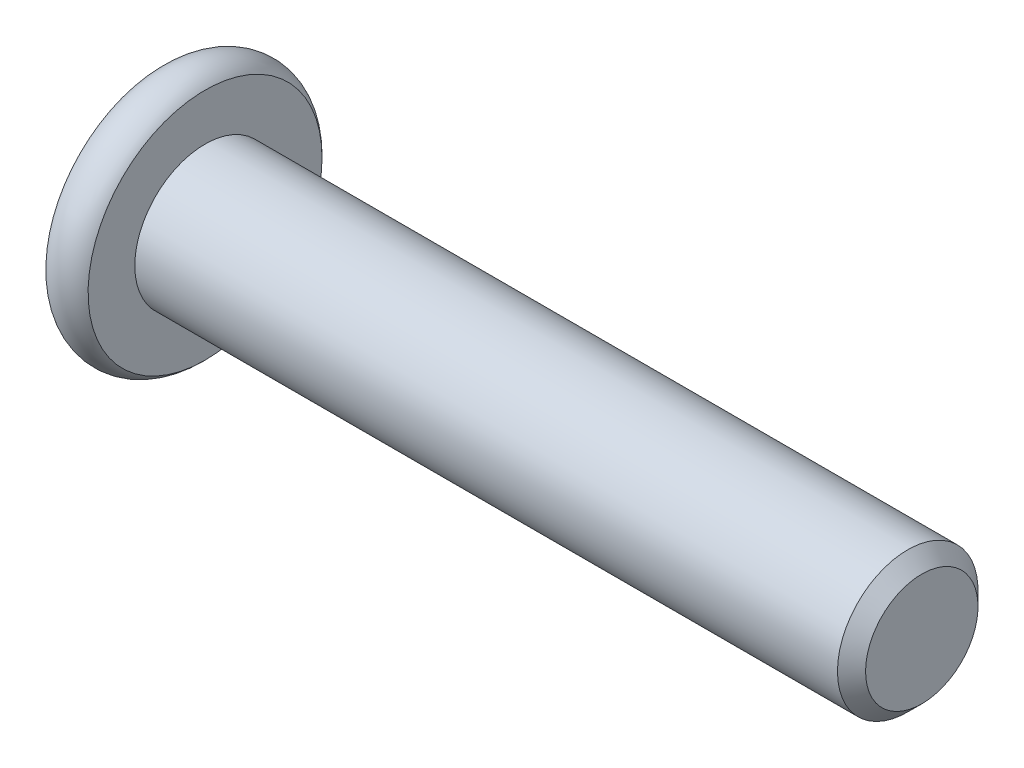
ISO-10303-21;
HEADER;
FILE_DESCRIPTION(('STEP AP214'),'2;1');
FILE_NAME('part.step','',(''),(''),'','','');
FILE_SCHEMA(('AUTOMOTIVE_DESIGN { 1 0 10303 214 1 1 1 1 }'));
ENDSEC;
DATA;
#1=APPLICATION_CONTEXT('core data for automotive mechanical design processes');
#2=APPLICATION_PROTOCOL_DEFINITION('international standard','automotive_design',2000,#1);
#3=PRODUCT_CONTEXT('',#1,'mechanical');
#4=PRODUCT('Part','Part','',(#3));
#5=PRODUCT_RELATED_PRODUCT_CATEGORY('part','',(#4));
#6=PRODUCT_DEFINITION_FORMATION('','',#4);
#7=PRODUCT_DEFINITION_CONTEXT('part definition',#1,'design');
#8=PRODUCT_DEFINITION('design','',#6,#7);
#9=PRODUCT_DEFINITION_SHAPE('','',#8);
#10=(LENGTH_UNIT() NAMED_UNIT(*) SI_UNIT(.MILLI.,.METRE.));
#11=(NAMED_UNIT(*) PLANE_ANGLE_UNIT() SI_UNIT($,.RADIAN.));
#12=(NAMED_UNIT(*) SI_UNIT($,.STERADIAN.) SOLID_ANGLE_UNIT());
#13=UNCERTAINTY_MEASURE_WITH_UNIT(LENGTH_MEASURE(1.E-05),#10,'distance_accuracy_value','');
#14=(GEOMETRIC_REPRESENTATION_CONTEXT(3) GLOBAL_UNCERTAINTY_ASSIGNED_CONTEXT((#13)) GLOBAL_UNIT_ASSIGNED_CONTEXT((#10,
#11,#12)) REPRESENTATION_CONTEXT('',''));
#15=CARTESIAN_POINT('',(0.,0.,0.));
#16=DIRECTION('',(0.,0.,1.));
#17=DIRECTION('',(1.,0.,0.));
#18=AXIS2_PLACEMENT_3D('',#15,#16,#17);
#19=CARTESIAN_POINT('',(-19.2,0.866025403784513,1.5));
#20=DIRECTION('',(0.,0.866025403784439,0.5));
#21=DIRECTION('',(1.,0.,0.));
#22=AXIS2_PLACEMENT_3D('',#19,#20,#21);
#23=PLANE('',#22);
#24=DIRECTION('',(-1.,0.,0.));
#25=VECTOR('',#24,1.);
#26=CARTESIAN_POINT('',(-19.2,0.866025403784513,1.5));
#27=LINE('',#26,#25);
#28=CARTESIAN_POINT('',(-19.2,0.866025403784513,1.5));
#29=VERTEX_POINT('',#28);
#30=CARTESIAN_POINT('',(-21.45,0.866025403784521,1.5));
#31=VERTEX_POINT('',#30);
#32=EDGE_CURVE('E11',#29,#31,#27,.T.);
#33=ORIENTED_EDGE('',*,*,#32,.T.);
#34=CARTESIAN_POINT('',(-21.45,0.866025403784521,1.5));
#35=CARTESIAN_POINT('',(-21.0169872981078,1.29903810567674,0.75));
#36=CARTESIAN_POINT('',(-21.45,1.73205080756896,0.));
#37=(BOUNDED_CURVE() B_SPLINE_CURVE(2,(#34,#35,#36),.UNSPECIFIED.,.F.,
.F.) B_SPLINE_CURVE_WITH_KNOTS((3,3),(-0.397875803425302,-0.136294992073016),
.UNSPECIFIED.) CURVE() GEOMETRIC_REPRESENTATION_ITEM() RATIONAL_B_SPLINE_CURVE((1.32487113059643,
1.52982940778283,1.32487113059643)) REPRESENTATION_ITEM(''));
#38=CARTESIAN_POINT('',(-21.45,1.73205080756896,0.));
#39=VERTEX_POINT('',#38);
#40=EDGE_CURVE('E217',#31,#39,#37,.T.);
#41=ORIENTED_EDGE('',*,*,#40,.T.);
#42=DIRECTION('',(-1.,0.,0.));
#43=VECTOR('',#42,1.);
#44=CARTESIAN_POINT('',(-19.2,1.73205080756895,0.));
#45=LINE('',#44,#43);
#46=CARTESIAN_POINT('',(-19.2,1.73205080756895,0.));
#47=VERTEX_POINT('',#46);
#48=EDGE_CURVE('E229',#47,#39,#45,.T.);
#49=ORIENTED_EDGE('',*,*,#48,.F.);
#50=DIRECTION('',(0.,0.5,-0.866025403784439));
#51=VECTOR('',#50,1.);
#52=CARTESIAN_POINT('',(-19.2,0.866025403784513,1.5));
#53=LINE('',#52,#51);
#54=EDGE_CURVE('E208',#29,#47,#53,.T.);
#55=ORIENTED_EDGE('',*,*,#54,.F.);
#56=EDGE_LOOP('',(#33,#41,#49,#55));
#57=FACE_BOUND('',#56,.T.);
#58=ADVANCED_FACE('F16',(#57),#23,.F.);
#59=CARTESIAN_POINT('',(-19.2,-0.866025403784366,1.5));
#60=DIRECTION('',(0.,0.,1.));
#61=DIRECTION('',(1.,0.,0.));
#62=AXIS2_PLACEMENT_3D('',#59,#60,#61);
#63=PLANE('',#62);
#64=DIRECTION('',(-1.,0.,0.));
#65=VECTOR('',#64,1.);
#66=CARTESIAN_POINT('',(-19.2,-0.866025403784366,1.5));
#67=LINE('',#66,#65);
#68=CARTESIAN_POINT('',(-19.2,-0.866025403784366,1.5));
#69=VERTEX_POINT('',#68);
#70=CARTESIAN_POINT('',(-21.45,-0.866025403784357,1.5));
#71=VERTEX_POINT('',#70);
#72=EDGE_CURVE('E27',#69,#71,#67,.T.);
#73=ORIENTED_EDGE('',*,*,#72,.T.);
#74=CARTESIAN_POINT('',(-21.45,-0.866025403784347,1.5));
#75=CARTESIAN_POINT('',(-21.0169872981078,0.,1.5));
#76=CARTESIAN_POINT('',(-21.45,0.866025403784519,1.5));
#77=(BOUNDED_CURVE() B_SPLINE_CURVE(2,(#74,#75,#76),.UNSPECIFIED.,.F.,
.F.) B_SPLINE_CURVE_WITH_KNOTS((3,3),(-0.397875803425301,-0.136294992073016),
.UNSPECIFIED.) CURVE() GEOMETRIC_REPRESENTATION_ITEM() RATIONAL_B_SPLINE_CURVE((1.32487113059644,
1.52982940778283,1.32487113059643)) REPRESENTATION_ITEM(''));
#78=EDGE_CURVE('E144',#71,#31,#77,.T.);
#79=ORIENTED_EDGE('',*,*,#78,.T.);
#80=ORIENTED_EDGE('',*,*,#32,.F.);
#81=DIRECTION('',(0.,1.,0.));
#82=VECTOR('',#81,1.);
#83=CARTESIAN_POINT('',(-19.2,-0.866025403784366,1.5));
#84=LINE('',#83,#82);
#85=EDGE_CURVE('E158',#69,#29,#84,.T.);
#86=ORIENTED_EDGE('',*,*,#85,.F.);
#87=EDGE_LOOP('',(#73,#79,#80,#86));
#88=FACE_BOUND('',#87,.T.);
#89=ADVANCED_FACE('F317',(#88),#63,.F.);
#90=CARTESIAN_POINT('',(-19.2,-1.7320508075688,0.));
#91=DIRECTION('',(0.,-0.866025403784439,0.5));
#92=DIRECTION('',(-1.,0.,0.));
#93=AXIS2_PLACEMENT_3D('',#90,#91,#92);
#94=PLANE('',#93);
#95=DIRECTION('',(-1.,0.,0.));
#96=VECTOR('',#95,1.);
#97=CARTESIAN_POINT('',(-19.2,-1.7320508075688,0.));
#98=LINE('',#97,#96);
#99=CARTESIAN_POINT('',(-19.2,-1.7320508075688,0.));
#100=VERTEX_POINT('',#99);
#101=CARTESIAN_POINT('',(-21.45,-1.73205080756879,0.));
#102=VERTEX_POINT('',#101);
#103=EDGE_CURVE('E123',#100,#102,#98,.T.);
#104=ORIENTED_EDGE('',*,*,#103,.T.);
#105=CARTESIAN_POINT('',(-21.45,-1.73205080756879,0.));
#106=CARTESIAN_POINT('',(-21.0169872981078,-1.29903810567658,0.750000000000001));
#107=CARTESIAN_POINT('',(-21.45,-0.866025403784359,1.5));
#108=(BOUNDED_CURVE() B_SPLINE_CURVE(2,(#105,#106,#107),.UNSPECIFIED.,.F.,
.F.) B_SPLINE_CURVE_WITH_KNOTS((3,3),(-0.397875803425302,-0.136294992073015),
.UNSPECIFIED.) CURVE() GEOMETRIC_REPRESENTATION_ITEM() RATIONAL_B_SPLINE_CURVE((1.32487113059644,
1.52982940778284,1.32487113059644)) REPRESENTATION_ITEM(''));
#109=EDGE_CURVE('E137',#102,#71,#108,.T.);
#110=ORIENTED_EDGE('',*,*,#109,.T.);
#111=ORIENTED_EDGE('',*,*,#72,.F.);
#112=DIRECTION('',(0.,0.5,0.866025403784439));
#113=VECTOR('',#112,1.);
#114=CARTESIAN_POINT('',(-19.2,-1.7320508075688,0.));
#115=LINE('',#114,#113);
#116=EDGE_CURVE('E152',#100,#69,#115,.T.);
#117=ORIENTED_EDGE('',*,*,#116,.F.);
#118=EDGE_LOOP('',(#104,#110,#111,#117));
#119=FACE_BOUND('',#118,.T.);
#120=ADVANCED_FACE('F323',(#119),#94,.F.);
#121=CARTESIAN_POINT('',(-19.2,-0.866025403784365,-1.5));
#122=DIRECTION('',(0.,-0.866025403784439,-0.5));
#123=DIRECTION('',(0.,0.5,-0.866025403784439));
#124=AXIS2_PLACEMENT_3D('',#121,#122,#123);
#125=PLANE('',#124);
#126=DIRECTION('',(-1.,0.,0.));
#127=VECTOR('',#126,1.);
#128=CARTESIAN_POINT('',(-19.2,-0.866025403784365,-1.5));
#129=LINE('',#128,#127);
#130=CARTESIAN_POINT('',(-19.2,-0.866025403784365,-1.5));
#131=VERTEX_POINT('',#130);
#132=CARTESIAN_POINT('',(-21.45,-0.866025403784356,-1.5));
#133=VERTEX_POINT('',#132);
#134=EDGE_CURVE('E113',#131,#133,#129,.T.);
#135=ORIENTED_EDGE('',*,*,#134,.T.);
#136=CARTESIAN_POINT('',(-21.45,-0.866025403784358,-1.5));
#137=CARTESIAN_POINT('',(-21.0169872981078,-1.29903810567658,-0.750000000000002));
#138=CARTESIAN_POINT('',(-21.45,-1.73205080756879,0.));
#139=(BOUNDED_CURVE() B_SPLINE_CURVE(2,(#136,#137,#138),.UNSPECIFIED.,.F.,
.F.) B_SPLINE_CURVE_WITH_KNOTS((3,3),(-0.397875803425301,-0.136294992073017),
.UNSPECIFIED.) CURVE() GEOMETRIC_REPRESENTATION_ITEM() RATIONAL_B_SPLINE_CURVE((1.32487113059642,
1.52982940778281,1.32487113059642)) REPRESENTATION_ITEM(''));
#140=EDGE_CURVE('E116',#133,#102,#139,.T.);
#141=ORIENTED_EDGE('',*,*,#140,.T.);
#142=ORIENTED_EDGE('',*,*,#103,.F.);
#143=DIRECTION('',(0.,-0.5,0.866025403784439));
#144=VECTOR('',#143,1.);
#145=CARTESIAN_POINT('',(-19.2,-0.866025403784365,-1.5));
#146=LINE('',#145,#144);
#147=EDGE_CURVE('E20',#131,#100,#146,.T.);
#148=ORIENTED_EDGE('',*,*,#147,.F.);
#149=EDGE_LOOP('',(#135,#141,#142,#148));
#150=FACE_BOUND('',#149,.T.);
#151=ADVANCED_FACE('F18',(#150),#125,.F.);
#152=CARTESIAN_POINT('',(-19.2,0.866025403784513,-1.5));
#153=DIRECTION('',(0.,0.,-1.));
#154=DIRECTION('',(-1.,0.,0.));
#155=AXIS2_PLACEMENT_3D('',#152,#153,#154);
#156=PLANE('',#155);
#157=DIRECTION('',(-1.,0.,0.));
#158=VECTOR('',#157,1.);
#159=CARTESIAN_POINT('',(-19.2,0.866025403784513,-1.5));
#160=LINE('',#159,#158);
#161=CARTESIAN_POINT('',(-19.2,0.866025403784513,-1.5));
#162=VERTEX_POINT('',#161);
#163=CARTESIAN_POINT('',(-21.45,0.866025403784521,-1.5));
#164=VERTEX_POINT('',#163);
#165=EDGE_CURVE('E124',#162,#164,#160,.T.);
#166=ORIENTED_EDGE('',*,*,#165,.T.);
#167=CARTESIAN_POINT('',(-21.45,0.866025403784517,-1.5));
#168=CARTESIAN_POINT('',(-21.0169872981078,0.,-1.5));
#169=CARTESIAN_POINT('',(-21.45,-0.866025403784355,-1.5));
#170=(BOUNDED_CURVE() B_SPLINE_CURVE(2,(#167,#168,#169),.UNSPECIFIED.,.F.,
.F.) B_SPLINE_CURVE_WITH_KNOTS((3,3),(-0.397875803425301,-0.136294992073018),
.UNSPECIFIED.) CURVE() GEOMETRIC_REPRESENTATION_ITEM() RATIONAL_B_SPLINE_CURVE((1.32487113059642,
1.5298294077828,1.32487113059642)) REPRESENTATION_ITEM(''));
#171=EDGE_CURVE('E127',#164,#133,#170,.T.);
#172=ORIENTED_EDGE('',*,*,#171,.T.);
#173=ORIENTED_EDGE('',*,*,#134,.F.);
#174=DIRECTION('',(0.,-1.,0.));
#175=VECTOR('',#174,1.);
#176=CARTESIAN_POINT('',(-19.2,0.866025403784513,-1.5));
#177=LINE('',#176,#175);
#178=EDGE_CURVE('E207',#162,#131,#177,.T.);
#179=ORIENTED_EDGE('',*,*,#178,.F.);
#180=EDGE_LOOP('',(#166,#172,#173,#179));
#181=FACE_BOUND('',#180,.T.);
#182=ADVANCED_FACE('F128',(#181),#156,.F.);
#183=CARTESIAN_POINT('',(-19.2,1.73205080756895,0.));
#184=DIRECTION('',(0.,0.866025403784439,-0.5));
#185=DIRECTION('',(-1.,0.,0.));
#186=AXIS2_PLACEMENT_3D('',#183,#184,#185);
#187=PLANE('',#186);
#188=ORIENTED_EDGE('',*,*,#48,.T.);
#189=CARTESIAN_POINT('',(-21.45,1.73205080756896,0.));
#190=CARTESIAN_POINT('',(-21.0169872981078,1.29903810567674,-0.75));
#191=CARTESIAN_POINT('',(-21.45,0.866025403784521,-1.5));
#192=(BOUNDED_CURVE() B_SPLINE_CURVE(2,(#189,#190,#191),.UNSPECIFIED.,.F.,
.F.) B_SPLINE_CURVE_WITH_KNOTS((3,3),(-0.397875803425301,-0.136294992073017),
.UNSPECIFIED.) CURVE() GEOMETRIC_REPRESENTATION_ITEM() RATIONAL_B_SPLINE_CURVE((1.32487113059642,
1.52982940778281,1.32487113059642)) REPRESENTATION_ITEM(''));
#193=EDGE_CURVE('E133',#39,#164,#192,.T.);
#194=ORIENTED_EDGE('',*,*,#193,.T.);
#195=ORIENTED_EDGE('',*,*,#165,.F.);
#196=DIRECTION('',(0.,-0.5,-0.866025403784439));
#197=VECTOR('',#196,1.);
#198=CARTESIAN_POINT('',(-19.2,1.73205080756895,0.));
#199=LINE('',#198,#197);
#200=EDGE_CURVE('E204',#47,#162,#199,.T.);
#201=ORIENTED_EDGE('',*,*,#200,.F.);
#202=EDGE_LOOP('',(#188,#194,#195,#201));
#203=FACE_BOUND('',#202,.T.);
#204=ADVANCED_FACE('F332',(#203),#187,.F.);
#205=CARTESIAN_POINT('',(-19.2,0.,0.));
#206=DIRECTION('',(-1.,0.,0.));
#207=DIRECTION('',(0.,0.,1.));
#208=AXIS2_PLACEMENT_3D('',#205,#206,#207);
#209=PLANE('',#208);
#210=ORIENTED_EDGE('',*,*,#54,.T.);
#211=ORIENTED_EDGE('',*,*,#200,.T.);
#212=ORIENTED_EDGE('',*,*,#178,.T.);
#213=ORIENTED_EDGE('',*,*,#147,.T.);
#214=ORIENTED_EDGE('',*,*,#116,.T.);
#215=ORIENTED_EDGE('',*,*,#85,.T.);
#216=EDGE_LOOP('',(#210,#211,#212,#213,#214,#215));
#217=FACE_BOUND('',#216,.T.);
#218=ADVANCED_FACE('F312',(#217),#209,.T.);
#219=CARTESIAN_POINT('',(-21.5,0.,0.));
#220=DIRECTION('',(-1.,0.,0.));
#221=DIRECTION('',(0.,-1.,0.));
#222=AXIS2_PLACEMENT_3D('',#219,#220,#221);
#223=CONICAL_SURFACE('',#222,1.78205080756886,0.78539816339745);
#224=ORIENTED_EDGE('',*,*,#78,.F.);
#225=ORIENTED_EDGE('',*,*,#109,.F.);
#226=ORIENTED_EDGE('',*,*,#140,.F.);
#227=ORIENTED_EDGE('',*,*,#171,.F.);
#228=ORIENTED_EDGE('',*,*,#193,.F.);
#229=DIRECTION('',(-0.707106781186544,0.707106781186551,0.));
#230=VECTOR('',#229,1.);
#231=CARTESIAN_POINT('',(-21.5,1.78205080756894,0.));
#232=LINE('',#231,#230);
#233=CARTESIAN_POINT('',(-21.5,1.78205080756894,0.));
#234=VERTEX_POINT('',#233);
#235=EDGE_CURVE('E164',#39,#234,#232,.T.);
#236=ORIENTED_EDGE('',*,*,#235,.T.);
#237=CARTESIAN_POINT('',(-21.5,0.,0.));
#238=DIRECTION('',(-1.,0.,0.));
#239=DIRECTION('',(0.,-1.,0.));
#240=AXIS2_PLACEMENT_3D('',#237,#238,#239);
#241=CIRCLE('',#240,1.78205080756886);
#242=CARTESIAN_POINT('',(-21.5,-1.78205080756877,0.));
#243=VERTEX_POINT('',#242);
#244=EDGE_CURVE('E174',#234,#243,#241,.T.);
#245=ORIENTED_EDGE('',*,*,#244,.T.);
#246=CARTESIAN_POINT('',(-21.5,0.,0.));
#247=DIRECTION('',(-1.,0.,0.));
#248=DIRECTION('',(0.,-1.,0.));
#249=AXIS2_PLACEMENT_3D('',#246,#247,#248);
#250=CIRCLE('',#249,1.78205080756886);
#251=EDGE_CURVE('E195',#243,#234,#250,.T.);
#252=ORIENTED_EDGE('',*,*,#251,.T.);
#253=ORIENTED_EDGE('',*,*,#235,.F.);
#254=ORIENTED_EDGE('',*,*,#40,.F.);
#255=EDGE_LOOP('',(#224,#225,#226,#227,#228,#236,#245,#252,#253,#254));
#256=FACE_BOUND('',#255,.T.);
#257=ADVANCED_FACE('F136',(#256),#223,.F.);
#258=CARTESIAN_POINT('',(-20.,4.16143782776615,0.));
#259=DIRECTION('',(-1.,0.,0.));
#260=DIRECTION('',(0.,0.,1.));
#261=AXIS2_PLACEMENT_3D('',#258,#259,#260);
#262=PLANE('',#261);
#263=CARTESIAN_POINT('',(-20.,0.,0.));
#264=DIRECTION('',(1.,0.,0.));
#265=DIRECTION('',(0.,-1.,0.));
#266=AXIS2_PLACEMENT_3D('',#263,#264,#265);
#267=CIRCLE('',#266,2.5);
#268=CARTESIAN_POINT('',(-20.,-2.5,0.));
#269=VERTEX_POINT('',#268);
#270=CARTESIAN_POINT('',(-20.,0.,2.5));
#271=VERTEX_POINT('',#270);
#272=EDGE_CURVE('E200',#269,#271,#267,.T.);
#273=ORIENTED_EDGE('',*,*,#272,.F.);
#274=CARTESIAN_POINT('',(-20.,0.,0.));
#275=DIRECTION('',(1.,0.,0.));
#276=DIRECTION('',(0.,-1.,0.));
#277=AXIS2_PLACEMENT_3D('',#274,#275,#276);
#278=CIRCLE('',#277,2.5);
#279=EDGE_CURVE('E203',#271,#269,#278,.T.);
#280=ORIENTED_EDGE('',*,*,#279,.F.);
#281=EDGE_LOOP('',(#273,#280));
#282=FACE_BOUND('',#281,.T.);
#283=CARTESIAN_POINT('',(-20.,0.,0.));
#284=DIRECTION('',(-1.,0.,0.));
#285=DIRECTION('',(0.,-1.,0.));
#286=AXIS2_PLACEMENT_3D('',#283,#284,#285);
#287=CIRCLE('',#286,4.16143782776615);
#288=CARTESIAN_POINT('',(-20.,-4.16143782776615,0.));
#289=VERTEX_POINT('',#288);
#290=CARTESIAN_POINT('',(-20.,0.,-4.16143782776615));
#291=VERTEX_POINT('',#290);
#292=EDGE_CURVE('E184',#289,#291,#287,.T.);
#293=ORIENTED_EDGE('',*,*,#292,.F.);
#294=CARTESIAN_POINT('',(-20.,0.,0.));
#295=DIRECTION('',(-1.,0.,0.));
#296=DIRECTION('',(0.,-1.,0.));
#297=AXIS2_PLACEMENT_3D('',#294,#295,#296);
#298=CIRCLE('',#297,4.16143782776615);
#299=EDGE_CURVE('E173',#291,#289,#298,.T.);
#300=ORIENTED_EDGE('',*,*,#299,.F.);
#301=EDGE_LOOP('',(#293,#300));
#302=FACE_BOUND('',#301,.T.);
#303=ADVANCED_FACE('F258',(#282,#302),#262,.F.);
#304=CARTESIAN_POINT('',(-20.75,0.,0.));
#305=DIRECTION('',(-1.,0.,0.));
#306=DIRECTION('',(0.,0.,1.));
#307=AXIS2_PLACEMENT_3D('',#304,#305,#306);
#308=TOROIDAL_SURFACE('',#307,3.5,1.);
#309=CARTESIAN_POINT('',(-21.5,0.,0.));
#310=DIRECTION('',(-1.,0.,0.));
#311=DIRECTION('',(0.,-1.,0.));
#312=AXIS2_PLACEMENT_3D('',#309,#310,#311);
#313=CIRCLE('',#312,4.16143782776615);
#314=CARTESIAN_POINT('',(-21.5,-4.16143782776614,0.));
#315=VERTEX_POINT('',#314);
#316=CARTESIAN_POINT('',(-21.5,0.,-4.16143782776615));
#317=VERTEX_POINT('',#316);
#318=EDGE_CURVE('E202',#315,#317,#313,.T.);
#319=ORIENTED_EDGE('',*,*,#318,.F.);
#320=CARTESIAN_POINT('',(-21.5,0.,0.));
#321=DIRECTION('',(-1.,0.,0.));
#322=DIRECTION('',(0.,-1.,0.));
#323=AXIS2_PLACEMENT_3D('',#320,#321,#322);
#324=CIRCLE('',#323,4.16143782776615);
#325=EDGE_CURVE('E199',#317,#315,#324,.T.);
#326=ORIENTED_EDGE('',*,*,#325,.F.);
#327=CARTESIAN_POINT('',(-20.75,0.,-3.5));
#328=DIRECTION('',(0.,-1.,0.));
#329=DIRECTION('',(0.,0.,-1.));
#330=AXIS2_PLACEMENT_3D('',#327,#328,#329);
#331=CIRCLE('',#330,1.);
#332=EDGE_CURVE('E170',#317,#291,#331,.T.);
#333=ORIENTED_EDGE('',*,*,#332,.T.);
#334=ORIENTED_EDGE('',*,*,#299,.T.);
#335=ORIENTED_EDGE('',*,*,#292,.T.);
#336=ORIENTED_EDGE('',*,*,#332,.F.);
#337=EDGE_LOOP('',(#319,#326,#333,#334,#335,#336));
#338=FACE_BOUND('',#337,.T.);
#339=ADVANCED_FACE('F255',(#338),#308,.T.);
#340=CARTESIAN_POINT('',(-21.5,0.,0.));
#341=DIRECTION('',(1.,0.,0.));
#342=DIRECTION('',(0.,-1.,0.));
#343=AXIS2_PLACEMENT_3D('',#340,#341,#342);
#344=PLANE('',#343);
#345=ORIENTED_EDGE('',*,*,#251,.F.);
#346=ORIENTED_EDGE('',*,*,#244,.F.);
#347=EDGE_LOOP('',(#345,#346));
#348=FACE_BOUND('',#347,.T.);
#349=ORIENTED_EDGE('',*,*,#318,.T.);
#350=ORIENTED_EDGE('',*,*,#325,.T.);
#351=EDGE_LOOP('',(#349,#350));
#352=FACE_BOUND('',#351,.T.);
#353=ADVANCED_FACE('F253',(#348,#352),#344,.F.);
#354=CARTESIAN_POINT('',(-20.,0.,0.));
#355=DIRECTION('',(1.,0.,0.));
#356=DIRECTION('',(0.,0.,-1.));
#357=AXIS2_PLACEMENT_3D('',#354,#355,#356);
#358=CYLINDRICAL_SURFACE('',#357,2.5);
#359=CARTESIAN_POINT('',(5.,0.,0.));
#360=DIRECTION('',(1.,0.,0.));
#361=DIRECTION('',(0.,0.,-1.));
#362=AXIS2_PLACEMENT_3D('',#359,#360,#361);
#363=CIRCLE('',#362,2.5);
#364=CARTESIAN_POINT('',(5.,0.,2.5));
#365=VERTEX_POINT('',#364);
#366=EDGE_CURVE('E150',#365,#365,#363,.T.);
#367=ORIENTED_EDGE('',*,*,#366,.F.);
#368=DIRECTION('',(-1.,0.,0.));
#369=VECTOR('',#368,1.);
#370=CARTESIAN_POINT('',(-20.,0.,2.5));
#371=LINE('',#370,#369);
#372=EDGE_CURVE('E281',#365,#271,#371,.T.);
#373=ORIENTED_EDGE('',*,*,#372,.T.);
#374=ORIENTED_EDGE('',*,*,#279,.T.);
#375=ORIENTED_EDGE('',*,*,#272,.T.);
#376=ORIENTED_EDGE('',*,*,#372,.F.);
#377=EDGE_LOOP('',(#367,#373,#374,#375,#376));
#378=FACE_BOUND('',#377,.T.);
#379=ADVANCED_FACE('F301',(#378),#358,.T.);
#380=CARTESIAN_POINT('',(5.5,0.,0.));
#381=DIRECTION('',(1.,0.,0.));
#382=DIRECTION('',(0.,1.,0.));
#383=AXIS2_PLACEMENT_3D('',#380,#381,#382);
#384=PLANE('',#383);
#385=CARTESIAN_POINT('',(5.5,0.,0.));
#386=DIRECTION('',(-1.,0.,0.));
#387=DIRECTION('',(0.,0.,-1.));
#388=AXIS2_PLACEMENT_3D('',#385,#386,#387);
#389=CIRCLE('',#388,2.);
#390=CARTESIAN_POINT('',(5.5,0.,2.));
#391=VERTEX_POINT('',#390);
#392=EDGE_CURVE('E185',#391,#391,#389,.T.);
#393=ORIENTED_EDGE('',*,*,#392,.F.);
#394=EDGE_LOOP('',(#393));
#395=FACE_BOUND('',#394,.T.);
#396=ADVANCED_FACE('F333',(#395),#384,.T.);
#397=CARTESIAN_POINT('',(5.25,0.,0.));
#398=DIRECTION('',(-1.,0.,0.));
#399=DIRECTION('',(0.,0.,-1.));
#400=AXIS2_PLACEMENT_3D('',#397,#398,#399);
#401=CONICAL_SURFACE('',#400,2.25,0.785398163397448);
#402=ORIENTED_EDGE('',*,*,#392,.T.);
#403=DIRECTION('',(-0.707106781186548,0.,0.707106781186547));
#404=VECTOR('',#403,1.);
#405=CARTESIAN_POINT('',(5.25,0.,2.25));
#406=LINE('',#405,#404);
#407=EDGE_CURVE('E188',#391,#365,#406,.T.);
#408=ORIENTED_EDGE('',*,*,#407,.T.);
#409=ORIENTED_EDGE('',*,*,#366,.T.);
#410=ORIENTED_EDGE('',*,*,#407,.F.);
#411=EDGE_LOOP('',(#402,#408,#409,#410));
#412=FACE_BOUND('',#411,.T.);
#413=ADVANCED_FACE('F299',(#412),#401,.T.);
#414=CLOSED_SHELL('',(#58,#89,#120,#151,#182,#204,#218,#257,#303,#339,#353,#379,#396,#413));
#415=MANIFOLD_SOLID_BREP('B1',#414);
#416=ADVANCED_BREP_SHAPE_REPRESENTATION('',(#18,#415),#14);
#417=SHAPE_DEFINITION_REPRESENTATION(#9,#416);
ENDSEC;
END-ISO-10303-21;
